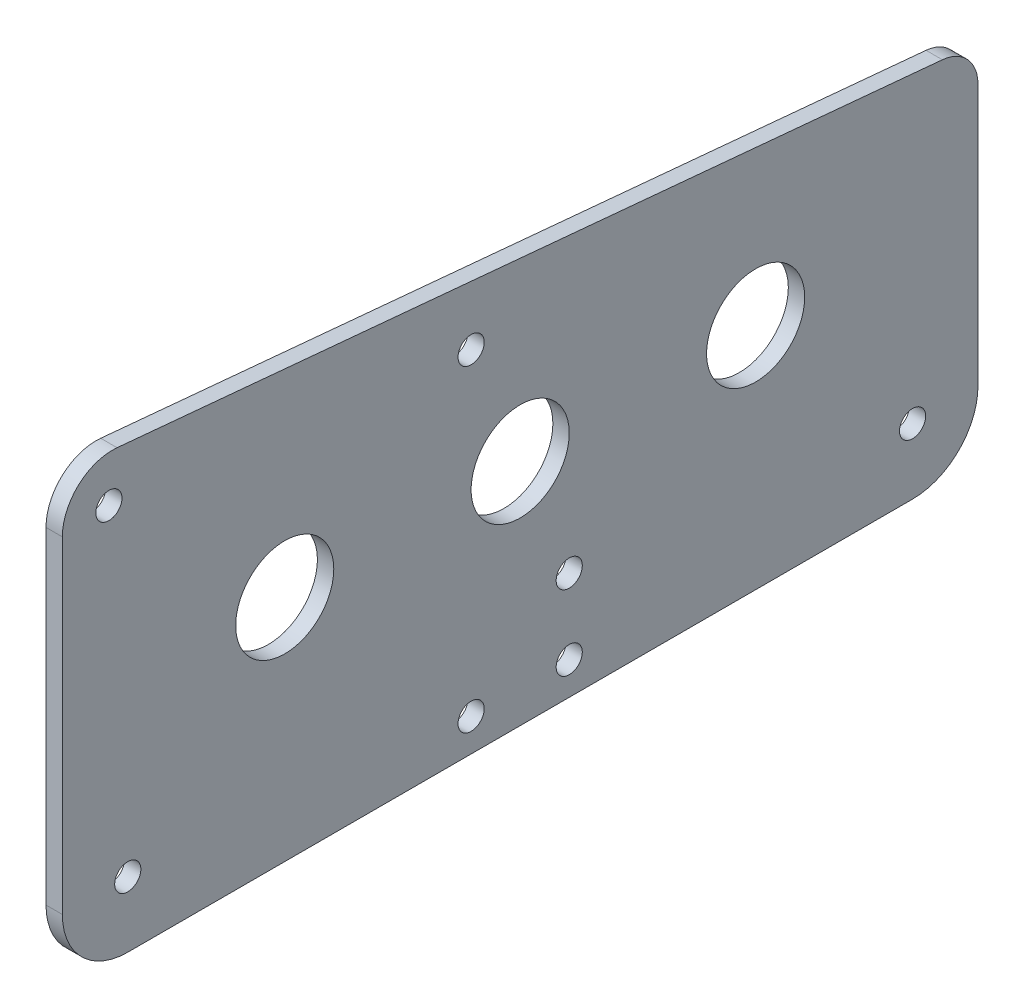
ISO-10303-21;
HEADER;
FILE_DESCRIPTION(('STEP AP214'),'2;1');
FILE_NAME('part.step','',(''),(''),'','','');
FILE_SCHEMA(('AUTOMOTIVE_DESIGN { 1 0 10303 214 1 1 1 1 }'));
ENDSEC;
DATA;
#1=APPLICATION_CONTEXT('core data for automotive mechanical design processes');
#2=APPLICATION_PROTOCOL_DEFINITION('international standard','automotive_design',2000,#1);
#3=PRODUCT_CONTEXT('',#1,'mechanical');
#4=PRODUCT('Part','Part','',(#3));
#5=PRODUCT_RELATED_PRODUCT_CATEGORY('part','',(#4));
#6=PRODUCT_DEFINITION_FORMATION('','',#4);
#7=PRODUCT_DEFINITION_CONTEXT('part definition',#1,'design');
#8=PRODUCT_DEFINITION('design','',#6,#7);
#9=PRODUCT_DEFINITION_SHAPE('','',#8);
#10=(LENGTH_UNIT() NAMED_UNIT(*) SI_UNIT(.MILLI.,.METRE.));
#11=(NAMED_UNIT(*) PLANE_ANGLE_UNIT() SI_UNIT($,.RADIAN.));
#12=(NAMED_UNIT(*) SI_UNIT($,.STERADIAN.) SOLID_ANGLE_UNIT());
#13=UNCERTAINTY_MEASURE_WITH_UNIT(LENGTH_MEASURE(1.E-05),#10,'distance_accuracy_value','');
#14=(GEOMETRIC_REPRESENTATION_CONTEXT(3) GLOBAL_UNCERTAINTY_ASSIGNED_CONTEXT((#13)) GLOBAL_UNIT_ASSIGNED_CONTEXT((#10,
#11,#12)) REPRESENTATION_CONTEXT('',''));
#15=CARTESIAN_POINT('',(0.,0.,0.));
#16=DIRECTION('',(0.,0.,1.));
#17=DIRECTION('',(1.,0.,0.));
#18=AXIS2_PLACEMENT_3D('',#15,#16,#17);
#19=CARTESIAN_POINT('',(4.7625,43.2742885665232,-519.572478048036));
#20=DIRECTION('',(1.,0.,0.));
#21=DIRECTION('',(0.,0.,-1.));
#22=AXIS2_PLACEMENT_3D('',#19,#20,#21);
#23=CYLINDRICAL_SURFACE('',#22,12.7);
#24=DIRECTION('',(1.,0.,0.));
#25=VECTOR('',#24,1.);
#26=CARTESIAN_POINT('',(4.7625,43.2742885665232,-506.872478048036));
#27=LINE('',#26,#25);
#28=CARTESIAN_POINT('',(1.5875,43.2742885665232,-506.872478048036));
#29=VERTEX_POINT('',#28);
#30=CARTESIAN_POINT('',(4.7625,43.2742885665232,-506.872478048036));
#31=VERTEX_POINT('',#30);
#32=EDGE_CURVE('E11',#29,#31,#27,.T.);
#33=ORIENTED_EDGE('',*,*,#32,.F.);
#34=CARTESIAN_POINT('',(1.5875,43.2742885665232,-519.572478048036));
#35=DIRECTION('',(1.,0.,0.));
#36=DIRECTION('',(0.,0.,-1.));
#37=AXIS2_PLACEMENT_3D('',#34,#35,#36);
#38=CIRCLE('',#37,12.7);
#39=CARTESIAN_POINT('',(1.5875,30.5742885665231,-519.572478048036));
#40=VERTEX_POINT('',#39);
#41=EDGE_CURVE('E107',#29,#40,#38,.T.);
#42=ORIENTED_EDGE('',*,*,#41,.T.);
#43=DIRECTION('',(1.,0.,0.));
#44=VECTOR('',#43,1.);
#45=CARTESIAN_POINT('',(4.7625,30.5742885665231,-519.572478048036));
#46=LINE('',#45,#44);
#47=CARTESIAN_POINT('',(4.7625,30.5742885665231,-519.572478048036));
#48=VERTEX_POINT('',#47);
#49=EDGE_CURVE('E48',#40,#48,#46,.T.);
#50=ORIENTED_EDGE('',*,*,#49,.T.);
#51=CARTESIAN_POINT('',(4.7625,43.2742885665232,-519.572478048036));
#52=DIRECTION('',(1.,0.,0.));
#53=DIRECTION('',(0.,0.,-1.));
#54=AXIS2_PLACEMENT_3D('',#51,#52,#53);
#55=CIRCLE('',#54,12.7);
#56=EDGE_CURVE('E164',#31,#48,#55,.T.);
#57=ORIENTED_EDGE('',*,*,#56,.F.);
#58=EDGE_LOOP('',(#33,#42,#50,#57));
#59=FACE_BOUND('',#58,.T.);
#60=ADVANCED_FACE('F38',(#59),#23,.T.);
#61=CARTESIAN_POINT('',(4.7625,30.5742885665232,-671.972478048036));
#62=DIRECTION('',(0.,-1.,0.));
#63=DIRECTION('',(0.,0.,-1.));
#64=AXIS2_PLACEMENT_3D('',#61,#62,#63);
#65=PLANE('',#64);
#66=ORIENTED_EDGE('',*,*,#49,.F.);
#67=DIRECTION('',(0.,0.,-1.));
#68=VECTOR('',#67,1.);
#69=CARTESIAN_POINT('',(1.5875,30.5742885665231,-516.597442574255));
#70=LINE('',#69,#68);
#71=CARTESIAN_POINT('',(1.5875,30.5742885665231,-671.972478048036));
#72=VERTEX_POINT('',#71);
#73=EDGE_CURVE('E129',#40,#72,#70,.T.);
#74=ORIENTED_EDGE('',*,*,#73,.T.);
#75=DIRECTION('',(1.,0.,0.));
#76=VECTOR('',#75,1.);
#77=CARTESIAN_POINT('',(4.7625,30.5742885665231,-671.972478048036));
#78=LINE('',#77,#76);
#79=CARTESIAN_POINT('',(4.7625,30.5742885665231,-671.972478048036));
#80=VERTEX_POINT('',#79);
#81=EDGE_CURVE('E157',#72,#80,#78,.T.);
#82=ORIENTED_EDGE('',*,*,#81,.T.);
#83=DIRECTION('',(0.,0.,-1.));
#84=VECTOR('',#83,1.);
#85=CARTESIAN_POINT('',(4.7625,30.5742885665232,-671.972478048036));
#86=LINE('',#85,#84);
#87=EDGE_CURVE('E174',#48,#80,#86,.T.);
#88=ORIENTED_EDGE('',*,*,#87,.F.);
#89=EDGE_LOOP('',(#66,#74,#82,#88));
#90=FACE_BOUND('',#89,.T.);
#91=ADVANCED_FACE('F177',(#90),#65,.T.);
#92=CARTESIAN_POINT('',(4.7625,43.2742885665232,-671.972478048036));
#93=DIRECTION('',(1.,0.,0.));
#94=DIRECTION('',(0.,0.,-1.));
#95=AXIS2_PLACEMENT_3D('',#92,#93,#94);
#96=CYLINDRICAL_SURFACE('',#95,12.7);
#97=ORIENTED_EDGE('',*,*,#81,.F.);
#98=CARTESIAN_POINT('',(1.5875,43.2742885665232,-671.972478048036));
#99=DIRECTION('',(1.,0.,0.));
#100=DIRECTION('',(0.,0.,-1.));
#101=AXIS2_PLACEMENT_3D('',#98,#99,#100);
#102=CIRCLE('',#101,12.7);
#103=CARTESIAN_POINT('',(1.5875,43.2742885665232,-684.672478048036));
#104=VERTEX_POINT('',#103);
#105=EDGE_CURVE('E126',#72,#104,#102,.T.);
#106=ORIENTED_EDGE('',*,*,#105,.T.);
#107=DIRECTION('',(1.,0.,0.));
#108=VECTOR('',#107,1.);
#109=CARTESIAN_POINT('',(4.7625,43.2742885665232,-684.672478048036));
#110=LINE('',#109,#108);
#111=CARTESIAN_POINT('',(4.7625,43.2742885665232,-684.672478048036));
#112=VERTEX_POINT('',#111);
#113=EDGE_CURVE('E154',#104,#112,#110,.T.);
#114=ORIENTED_EDGE('',*,*,#113,.T.);
#115=CARTESIAN_POINT('',(4.7625,43.2742885665232,-671.972478048036));
#116=DIRECTION('',(1.,0.,0.));
#117=DIRECTION('',(0.,0.,-1.));
#118=AXIS2_PLACEMENT_3D('',#115,#116,#117);
#119=CIRCLE('',#118,12.7);
#120=EDGE_CURVE('E178',#80,#112,#119,.T.);
#121=ORIENTED_EDGE('',*,*,#120,.F.);
#122=EDGE_LOOP('',(#97,#106,#114,#121));
#123=FACE_BOUND('',#122,.T.);
#124=ADVANCED_FACE('F240',(#123),#96,.T.);
#125=CARTESIAN_POINT('',(4.7625,93.978860816529,-684.672478048036));
#126=DIRECTION('',(0.,0.,-1.));
#127=DIRECTION('',(0.,1.,0.));
#128=AXIS2_PLACEMENT_3D('',#125,#126,#127);
#129=PLANE('',#128);
#130=ORIENTED_EDGE('',*,*,#113,.F.);
#131=DIRECTION('',(0.,1.,0.));
#132=VECTOR('',#131,1.);
#133=CARTESIAN_POINT('',(1.5875,106.774288566523,-684.672478048036));
#134=LINE('',#133,#132);
#135=CARTESIAN_POINT('',(1.5875,93.978860816529,-684.672478048036));
#136=VERTEX_POINT('',#135);
#137=EDGE_CURVE('E123',#104,#136,#134,.T.);
#138=ORIENTED_EDGE('',*,*,#137,.T.);
#139=DIRECTION('',(1.,0.,0.));
#140=VECTOR('',#139,1.);
#141=CARTESIAN_POINT('',(4.7625,93.978860816529,-684.672478048036));
#142=LINE('',#141,#140);
#143=CARTESIAN_POINT('',(4.7625,93.978860816529,-684.672478048036));
#144=VERTEX_POINT('',#143);
#145=EDGE_CURVE('E151',#136,#144,#142,.T.);
#146=ORIENTED_EDGE('',*,*,#145,.T.);
#147=DIRECTION('',(0.,1.,0.));
#148=VECTOR('',#147,1.);
#149=CARTESIAN_POINT('',(4.7625,93.978860816529,-684.672478048036));
#150=LINE('',#149,#148);
#151=EDGE_CURVE('E180',#112,#144,#150,.T.);
#152=ORIENTED_EDGE('',*,*,#151,.F.);
#153=EDGE_LOOP('',(#130,#138,#146,#152));
#154=FACE_BOUND('',#153,.T.);
#155=ADVANCED_FACE('F318',(#154),#129,.T.);
#156=CARTESIAN_POINT('',(4.7625,93.978860816529,-677.052478048036));
#157=DIRECTION('',(1.,0.,0.));
#158=DIRECTION('',(0.,0.,-1.));
#159=AXIS2_PLACEMENT_3D('',#156,#157,#158);
#160=CYLINDRICAL_SURFACE('',#159,7.61999999999997);
#161=ORIENTED_EDGE('',*,*,#145,.F.);
#162=CARTESIAN_POINT('',(1.5875,93.978860816529,-677.052478048036));
#163=DIRECTION('',(1.,0.,0.));
#164=DIRECTION('',(0.,0.,-1.));
#165=AXIS2_PLACEMENT_3D('',#162,#163,#164);
#166=CIRCLE('',#165,7.61999999999997);
#167=CARTESIAN_POINT('',(1.5875,101.566176390487,-677.757490375002));
#168=VERTEX_POINT('',#167);
#169=EDGE_CURVE('E120',#136,#168,#166,.T.);
#170=ORIENTED_EDGE('',*,*,#169,.T.);
#171=DIRECTION('',(1.,0.,0.));
#172=VECTOR('',#171,1.);
#173=CARTESIAN_POINT('',(4.7625,101.566176390487,-677.757490375002));
#174=LINE('',#173,#172);
#175=CARTESIAN_POINT('',(4.7625,101.566176390487,-677.757490375002));
#176=VERTEX_POINT('',#175);
#177=EDGE_CURVE('E149',#168,#176,#174,.T.);
#178=ORIENTED_EDGE('',*,*,#177,.T.);
#179=CARTESIAN_POINT('',(4.7625,93.978860816529,-677.052478048036));
#180=DIRECTION('',(1.,0.,0.));
#181=DIRECTION('',(0.,0.,-1.));
#182=AXIS2_PLACEMENT_3D('',#179,#180,#181);
#183=CIRCLE('',#182,7.61999999999997);
#184=EDGE_CURVE('E186',#144,#176,#183,.T.);
#185=ORIENTED_EDGE('',*,*,#184,.F.);
#186=EDGE_LOOP('',(#161,#170,#178,#185));
#187=FACE_BOUND('',#186,.T.);
#188=ADVANCED_FACE('F323',(#187),#160,.T.);
#189=CARTESIAN_POINT('',(4.7625,116.457539853395,-517.497208961432));
#190=DIRECTION('',(0.,0.995710705243837,-0.0925213027514316));
#191=DIRECTION('',(0.,0.0925213027514316,0.995710705243836));
#192=AXIS2_PLACEMENT_3D('',#189,#190,#191);
#193=PLANE('',#192);
#194=ORIENTED_EDGE('',*,*,#177,.F.);
#195=DIRECTION('',(0.,0.0925213027514316,0.995710705243836));
#196=VECTOR('',#195,1.);
#197=CARTESIAN_POINT('',(1.5875,116.457539853395,-517.497208961432));
#198=LINE('',#197,#196);
#199=CARTESIAN_POINT('',(1.5875,116.457539853395,-517.497208961432));
#200=VERTEX_POINT('',#199);
#201=EDGE_CURVE('E117',#168,#200,#198,.T.);
#202=ORIENTED_EDGE('',*,*,#201,.T.);
#203=DIRECTION('',(1.,0.,0.));
#204=VECTOR('',#203,1.);
#205=CARTESIAN_POINT('',(4.7625,116.457539853395,-517.497208961432));
#206=LINE('',#205,#204);
#207=CARTESIAN_POINT('',(4.7625,116.457539853395,-517.497208961432));
#208=VERTEX_POINT('',#207);
#209=EDGE_CURVE('E56',#200,#208,#206,.T.);
#210=ORIENTED_EDGE('',*,*,#209,.T.);
#211=DIRECTION('',(0.,0.0925213027514316,0.995710705243836));
#212=VECTOR('',#211,1.);
#213=CARTESIAN_POINT('',(4.7625,116.457539853395,-517.497208961432));
#214=LINE('',#213,#212);
#215=EDGE_CURVE('E189',#176,#208,#214,.T.);
#216=ORIENTED_EDGE('',*,*,#215,.F.);
#217=EDGE_LOOP('',(#194,#202,#210,#216));
#218=FACE_BOUND('',#217,.T.);
#219=ADVANCED_FACE('F324',(#218),#193,.T.);
#220=CARTESIAN_POINT('',(4.7625,106.774288566523,-516.597442574255));
#221=DIRECTION('',(1.,0.,0.));
#222=DIRECTION('',(0.,0.,-1.));
#223=AXIS2_PLACEMENT_3D('',#220,#221,#222);
#224=CYLINDRICAL_SURFACE('',#223,9.72496452621818);
#225=ORIENTED_EDGE('',*,*,#209,.F.);
#226=CARTESIAN_POINT('',(1.5875,106.774288566523,-516.597442574255));
#227=DIRECTION('',(1.,0.,0.));
#228=DIRECTION('',(0.,0.,-1.));
#229=AXIS2_PLACEMENT_3D('',#226,#227,#228);
#230=CIRCLE('',#229,9.72496452621818);
#231=CARTESIAN_POINT('',(1.5875,106.774288566523,-506.872478048036));
#232=VERTEX_POINT('',#231);
#233=EDGE_CURVE('E105',#200,#232,#230,.T.);
#234=ORIENTED_EDGE('',*,*,#233,.T.);
#235=DIRECTION('',(1.,0.,0.));
#236=VECTOR('',#235,1.);
#237=CARTESIAN_POINT('',(4.7625,106.774288566523,-506.872478048036));
#238=LINE('',#237,#236);
#239=CARTESIAN_POINT('',(4.7625,106.774288566523,-506.872478048036));
#240=VERTEX_POINT('',#239);
#241=EDGE_CURVE('E42',#232,#240,#238,.T.);
#242=ORIENTED_EDGE('',*,*,#241,.T.);
#243=CARTESIAN_POINT('',(4.7625,106.774288566523,-516.597442574255));
#244=DIRECTION('',(1.,0.,0.));
#245=DIRECTION('',(0.,0.,-1.));
#246=AXIS2_PLACEMENT_3D('',#243,#244,#245);
#247=CIRCLE('',#246,9.72496452621818);
#248=EDGE_CURVE('E310',#208,#240,#247,.T.);
#249=ORIENTED_EDGE('',*,*,#248,.F.);
#250=EDGE_LOOP('',(#225,#234,#242,#249));
#251=FACE_BOUND('',#250,.T.);
#252=ADVANCED_FACE('F109',(#251),#224,.T.);
#253=CARTESIAN_POINT('',(4.7625,43.2742885665232,-519.572478048036));
#254=DIRECTION('',(1.,0.,0.));
#255=DIRECTION('',(0.,0.,-1.));
#256=AXIS2_PLACEMENT_3D('',#253,#254,#255);
#257=CYLINDRICAL_SURFACE('',#256,2.53999999999995);
#258=CARTESIAN_POINT('',(4.7625,43.2742885665232,-519.572478048036));
#259=DIRECTION('',(1.,0.,0.));
#260=DIRECTION('',(0.,0.,-1.));
#261=AXIS2_PLACEMENT_3D('',#258,#259,#260);
#262=CIRCLE('',#261,2.53999999999995);
#263=CARTESIAN_POINT('',(4.7625,43.2742885665232,-522.112478048036));
#264=VERTEX_POINT('',#263);
#265=EDGE_CURVE('E147',#264,#264,#262,.T.);
#266=ORIENTED_EDGE('',*,*,#265,.T.);
#267=EDGE_LOOP('',(#266));
#268=FACE_BOUND('',#267,.T.);
#269=CARTESIAN_POINT('',(1.5875,43.2742885665232,-519.572478048036));
#270=DIRECTION('',(1.,0.,0.));
#271=DIRECTION('',(0.,0.,-1.));
#272=AXIS2_PLACEMENT_3D('',#269,#270,#271);
#273=CIRCLE('',#272,2.53999999999995);
#274=CARTESIAN_POINT('',(1.5875,43.2742885665232,-522.112478048036));
#275=VERTEX_POINT('',#274);
#276=EDGE_CURVE('E206',#275,#275,#273,.T.);
#277=ORIENTED_EDGE('',*,*,#276,.F.);
#278=EDGE_LOOP('',(#277));
#279=FACE_BOUND('',#278,.T.);
#280=ADVANCED_FACE('F281',(#268,#279),#257,.F.);
#281=CARTESIAN_POINT('',(4.7625,36.9242885665232,-605.297478048036));
#282=DIRECTION('',(1.,0.,0.));
#283=DIRECTION('',(0.,0.,-1.));
#284=AXIS2_PLACEMENT_3D('',#281,#282,#283);
#285=CYLINDRICAL_SURFACE('',#284,2.53999999999995);
#286=CARTESIAN_POINT('',(4.7625,36.9242885665232,-605.297478048036));
#287=DIRECTION('',(1.,0.,0.));
#288=DIRECTION('',(0.,0.,-1.));
#289=AXIS2_PLACEMENT_3D('',#286,#287,#288);
#290=CIRCLE('',#289,2.53999999999995);
#291=CARTESIAN_POINT('',(4.7625,36.9242885665232,-607.837478048036));
#292=VERTEX_POINT('',#291);
#293=EDGE_CURVE('E292',#292,#292,#290,.T.);
#294=ORIENTED_EDGE('',*,*,#293,.T.);
#295=EDGE_LOOP('',(#294));
#296=FACE_BOUND('',#295,.T.);
#297=CARTESIAN_POINT('',(1.5875,36.9242885665232,-605.297478048036));
#298=DIRECTION('',(1.,0.,0.));
#299=DIRECTION('',(0.,0.,-1.));
#300=AXIS2_PLACEMENT_3D('',#297,#298,#299);
#301=CIRCLE('',#300,2.53999999999995);
#302=CARTESIAN_POINT('',(1.5875,36.9242885665232,-607.837478048036));
#303=VERTEX_POINT('',#302);
#304=EDGE_CURVE('E209',#303,#303,#301,.T.);
#305=ORIENTED_EDGE('',*,*,#304,.F.);
#306=EDGE_LOOP('',(#305));
#307=FACE_BOUND('',#306,.T.);
#308=ADVANCED_FACE('F231',(#296,#307),#285,.F.);
#309=CARTESIAN_POINT('',(4.7625,98.5707187630519,-586.247478048036));
#310=DIRECTION('',(1.,0.,0.));
#311=DIRECTION('',(0.,0.,-1.));
#312=AXIS2_PLACEMENT_3D('',#309,#310,#311);
#313=CYLINDRICAL_SURFACE('',#312,2.53999999999995);
#314=CARTESIAN_POINT('',(4.7625,98.5707187630519,-586.247478048036));
#315=DIRECTION('',(1.,0.,0.));
#316=DIRECTION('',(0.,0.,-1.));
#317=AXIS2_PLACEMENT_3D('',#314,#315,#316);
#318=CIRCLE('',#317,2.53999999999995);
#319=CARTESIAN_POINT('',(4.7625,98.5707187630519,-588.787478048036));
#320=VERTEX_POINT('',#319);
#321=EDGE_CURVE('E298',#320,#320,#318,.T.);
#322=ORIENTED_EDGE('',*,*,#321,.T.);
#323=EDGE_LOOP('',(#322));
#324=FACE_BOUND('',#323,.T.);
#325=CARTESIAN_POINT('',(1.5875,98.5707187630519,-586.247478048036));
#326=DIRECTION('',(1.,0.,0.));
#327=DIRECTION('',(0.,0.,-1.));
#328=AXIS2_PLACEMENT_3D('',#325,#326,#327);
#329=CIRCLE('',#328,2.53999999999995);
#330=CARTESIAN_POINT('',(1.5875,98.5707187630519,-588.787478048036));
#331=VERTEX_POINT('',#330);
#332=EDGE_CURVE('E212',#331,#331,#329,.T.);
#333=ORIENTED_EDGE('',*,*,#332,.F.);
#334=EDGE_LOOP('',(#333));
#335=FACE_BOUND('',#334,.T.);
#336=ADVANCED_FACE('F222',(#324,#335),#313,.F.);
#337=CARTESIAN_POINT('',(4.7625,75.0242885665232,-595.772478048036));
#338=DIRECTION('',(1.,0.,0.));
#339=DIRECTION('',(0.,0.,-1.));
#340=AXIS2_PLACEMENT_3D('',#337,#338,#339);
#341=CYLINDRICAL_SURFACE('',#340,9.52500000000002);
#342=CARTESIAN_POINT('',(4.7625,75.0242885665232,-595.772478048036));
#343=DIRECTION('',(1.,0.,0.));
#344=DIRECTION('',(0.,0.,-1.));
#345=AXIS2_PLACEMENT_3D('',#342,#343,#344);
#346=CIRCLE('',#345,9.52500000000002);
#347=CARTESIAN_POINT('',(4.7625,75.0242885665232,-605.297478048036));
#348=VERTEX_POINT('',#347);
#349=EDGE_CURVE('E301',#348,#348,#346,.T.);
#350=ORIENTED_EDGE('',*,*,#349,.T.);
#351=EDGE_LOOP('',(#350));
#352=FACE_BOUND('',#351,.T.);
#353=CARTESIAN_POINT('',(1.5875,75.0242885665232,-595.772478048036));
#354=DIRECTION('',(1.,0.,0.));
#355=DIRECTION('',(0.,0.,-1.));
#356=AXIS2_PLACEMENT_3D('',#353,#354,#355);
#357=CIRCLE('',#356,9.52500000000002);
#358=CARTESIAN_POINT('',(1.5875,75.0242885665232,-605.297478048036));
#359=VERTEX_POINT('',#358);
#360=EDGE_CURVE('E113',#359,#359,#357,.T.);
#361=ORIENTED_EDGE('',*,*,#360,.F.);
#362=EDGE_LOOP('',(#361));
#363=FACE_BOUND('',#362,.T.);
#364=ADVANCED_FACE('F219',(#352,#363),#341,.F.);
#365=CARTESIAN_POINT('',(4.7625,107.527203864905,-515.91124467509));
#366=DIRECTION('',(1.,0.,0.));
#367=DIRECTION('',(0.,0.,-1.));
#368=AXIS2_PLACEMENT_3D('',#365,#366,#367);
#369=CYLINDRICAL_SURFACE('',#368,2.53999999999995);
#370=CARTESIAN_POINT('',(4.7625,107.527203864905,-515.91124467509));
#371=DIRECTION('',(1.,0.,0.));
#372=DIRECTION('',(0.,0.,-1.));
#373=AXIS2_PLACEMENT_3D('',#370,#371,#372);
#374=CIRCLE('',#373,2.53999999999995);
#375=CARTESIAN_POINT('',(4.7625,107.527203864905,-518.45124467509));
#376=VERTEX_POINT('',#375);
#377=EDGE_CURVE('E307',#376,#376,#374,.T.);
#378=ORIENTED_EDGE('',*,*,#377,.T.);
#379=EDGE_LOOP('',(#378));
#380=FACE_BOUND('',#379,.T.);
#381=CARTESIAN_POINT('',(1.5875,107.527203864905,-515.91124467509));
#382=DIRECTION('',(1.,0.,0.));
#383=DIRECTION('',(0.,0.,-1.));
#384=AXIS2_PLACEMENT_3D('',#381,#382,#383);
#385=CIRCLE('',#384,2.53999999999995);
#386=CARTESIAN_POINT('',(1.5875,107.527203864905,-518.45124467509));
#387=VERTEX_POINT('',#386);
#388=EDGE_CURVE('E110',#387,#387,#385,.T.);
#389=ORIENTED_EDGE('',*,*,#388,.F.);
#390=EDGE_LOOP('',(#389));
#391=FACE_BOUND('',#390,.T.);
#392=ADVANCED_FACE('F221',(#380,#391),#369,.F.);
#393=CARTESIAN_POINT('',(4.7625,43.2742885665232,-506.872478048036));
#394=DIRECTION('',(0.,0.,1.));
#395=DIRECTION('',(0.,-1.,0.));
#396=AXIS2_PLACEMENT_3D('',#393,#394,#395);
#397=PLANE('',#396);
#398=DIRECTION('',(0.,1.,0.));
#399=VECTOR('',#398,1.);
#400=CARTESIAN_POINT('',(1.5875,106.774288566523,-506.872478048036));
#401=LINE('',#400,#399);
#402=EDGE_CURVE('E93',#232,#29,#401,.F.);
#403=ORIENTED_EDGE('',*,*,#402,.T.);
#404=ORIENTED_EDGE('',*,*,#32,.T.);
#405=DIRECTION('',(0.,-1.,0.));
#406=VECTOR('',#405,1.);
#407=CARTESIAN_POINT('',(4.7625,43.2742885665232,-506.872478048036));
#408=LINE('',#407,#406);
#409=EDGE_CURVE('E95',#240,#31,#408,.T.);
#410=ORIENTED_EDGE('',*,*,#409,.F.);
#411=ORIENTED_EDGE('',*,*,#241,.F.);
#412=EDGE_LOOP('',(#403,#404,#410,#411));
#413=FACE_BOUND('',#412,.T.);
#414=ADVANCED_FACE('F92',(#413),#397,.T.);
#415=CARTESIAN_POINT('',(4.7625,75.0242885665232,-550.052478048036));
#416=DIRECTION('',(1.,0.,0.));
#417=DIRECTION('',(0.,0.,-1.));
#418=AXIS2_PLACEMENT_3D('',#415,#416,#417);
#419=CYLINDRICAL_SURFACE('',#418,9.52500000000002);
#420=CARTESIAN_POINT('',(4.7625,75.0242885665232,-550.052478048036));
#421=DIRECTION('',(1.,0.,0.));
#422=DIRECTION('',(0.,0.,-1.));
#423=AXIS2_PLACEMENT_3D('',#420,#421,#422);
#424=CIRCLE('',#423,9.52500000000002);
#425=CARTESIAN_POINT('',(4.7625,75.0242885665232,-559.577478048036));
#426=VERTEX_POINT('',#425);
#427=EDGE_CURVE('E192',#426,#426,#424,.T.);
#428=ORIENTED_EDGE('',*,*,#427,.T.);
#429=EDGE_LOOP('',(#428));
#430=FACE_BOUND('',#429,.T.);
#431=CARTESIAN_POINT('',(1.5875,75.0242885665232,-550.052478048036));
#432=DIRECTION('',(1.,0.,0.));
#433=DIRECTION('',(0.,0.,-1.));
#434=AXIS2_PLACEMENT_3D('',#431,#432,#433);
#435=CIRCLE('',#434,9.52500000000002);
#436=CARTESIAN_POINT('',(1.5875,75.0242885665232,-559.577478048036));
#437=VERTEX_POINT('',#436);
#438=EDGE_CURVE('E119',#437,#437,#435,.T.);
#439=ORIENTED_EDGE('',*,*,#438,.F.);
#440=EDGE_LOOP('',(#439));
#441=FACE_BOUND('',#440,.T.);
#442=ADVANCED_FACE('F246',(#430,#441),#419,.F.);
#443=CARTESIAN_POINT('',(4.7625,51.4778583699945,-605.297478048036));
#444=DIRECTION('',(1.,0.,0.));
#445=DIRECTION('',(0.,0.,-1.));
#446=AXIS2_PLACEMENT_3D('',#443,#444,#445);
#447=CYLINDRICAL_SURFACE('',#446,2.54000000000007);
#448=CARTESIAN_POINT('',(4.7625,51.4778583699945,-605.297478048036));
#449=DIRECTION('',(1.,0.,0.));
#450=DIRECTION('',(0.,0.,-1.));
#451=AXIS2_PLACEMENT_3D('',#448,#449,#450);
#452=CIRCLE('',#451,2.54000000000007);
#453=CARTESIAN_POINT('',(4.7625,51.4778583699945,-607.837478048036));
#454=VERTEX_POINT('',#453);
#455=EDGE_CURVE('E195',#454,#454,#452,.T.);
#456=ORIENTED_EDGE('',*,*,#455,.T.);
#457=EDGE_LOOP('',(#456));
#458=FACE_BOUND('',#457,.T.);
#459=CARTESIAN_POINT('',(1.5875,51.4778583699945,-605.297478048036));
#460=DIRECTION('',(1.,0.,0.));
#461=DIRECTION('',(0.,0.,-1.));
#462=AXIS2_PLACEMENT_3D('',#459,#460,#461);
#463=CIRCLE('',#462,2.54000000000007);
#464=CARTESIAN_POINT('',(1.5875,51.4778583699945,-607.837478048036));
#465=VERTEX_POINT('',#464);
#466=EDGE_CURVE('E135',#465,#465,#463,.T.);
#467=ORIENTED_EDGE('',*,*,#466,.F.);
#468=EDGE_LOOP('',(#467));
#469=FACE_BOUND('',#468,.T.);
#470=ADVANCED_FACE('F249',(#458,#469),#447,.F.);
#471=CARTESIAN_POINT('',(4.7625,75.0242885665232,-641.492478048036));
#472=DIRECTION('',(1.,0.,0.));
#473=DIRECTION('',(0.,0.,-1.));
#474=AXIS2_PLACEMENT_3D('',#471,#472,#473);
#475=CYLINDRICAL_SURFACE('',#474,9.52500000000002);
#476=CARTESIAN_POINT('',(4.7625,75.0242885665232,-641.492478048036));
#477=DIRECTION('',(1.,0.,0.));
#478=DIRECTION('',(0.,0.,-1.));
#479=AXIS2_PLACEMENT_3D('',#476,#477,#478);
#480=CIRCLE('',#479,9.52500000000002);
#481=CARTESIAN_POINT('',(4.7625,75.0242885665232,-651.017478048036));
#482=VERTEX_POINT('',#481);
#483=EDGE_CURVE('E198',#482,#482,#480,.T.);
#484=ORIENTED_EDGE('',*,*,#483,.T.);
#485=EDGE_LOOP('',(#484));
#486=FACE_BOUND('',#485,.T.);
#487=CARTESIAN_POINT('',(1.5875,75.0242885665232,-641.492478048036));
#488=DIRECTION('',(1.,0.,0.));
#489=DIRECTION('',(0.,0.,-1.));
#490=AXIS2_PLACEMENT_3D('',#487,#488,#489);
#491=CIRCLE('',#490,9.52500000000002);
#492=CARTESIAN_POINT('',(1.5875,75.0242885665232,-651.017478048036));
#493=VERTEX_POINT('',#492);
#494=EDGE_CURVE('E138',#493,#493,#491,.T.);
#495=ORIENTED_EDGE('',*,*,#494,.F.);
#496=EDGE_LOOP('',(#495));
#497=FACE_BOUND('',#496,.T.);
#498=ADVANCED_FACE('F253',(#486,#497),#475,.F.);
#499=CARTESIAN_POINT('',(4.7625,36.9242885665232,-586.247478048036));
#500=DIRECTION('',(1.,0.,0.));
#501=DIRECTION('',(0.,0.,-1.));
#502=AXIS2_PLACEMENT_3D('',#499,#500,#501);
#503=CYLINDRICAL_SURFACE('',#502,2.53999999999995);
#504=CARTESIAN_POINT('',(4.7625,36.9242885665232,-586.247478048036));
#505=DIRECTION('',(1.,0.,0.));
#506=DIRECTION('',(0.,0.,-1.));
#507=AXIS2_PLACEMENT_3D('',#504,#505,#506);
#508=CIRCLE('',#507,2.53999999999995);
#509=CARTESIAN_POINT('',(4.7625,36.9242885665232,-588.787478048036));
#510=VERTEX_POINT('',#509);
#511=EDGE_CURVE('E201',#510,#510,#508,.T.);
#512=ORIENTED_EDGE('',*,*,#511,.T.);
#513=EDGE_LOOP('',(#512));
#514=FACE_BOUND('',#513,.T.);
#515=CARTESIAN_POINT('',(1.5875,36.9242885665232,-586.247478048036));
#516=DIRECTION('',(1.,0.,0.));
#517=DIRECTION('',(0.,0.,-1.));
#518=AXIS2_PLACEMENT_3D('',#515,#516,#517);
#519=CIRCLE('',#518,2.53999999999995);
#520=CARTESIAN_POINT('',(1.5875,36.9242885665232,-588.787478048036));
#521=VERTEX_POINT('',#520);
#522=EDGE_CURVE('E141',#521,#521,#519,.T.);
#523=ORIENTED_EDGE('',*,*,#522,.F.);
#524=EDGE_LOOP('',(#523));
#525=FACE_BOUND('',#524,.T.);
#526=ADVANCED_FACE('F256',(#514,#525),#503,.F.);
#527=CARTESIAN_POINT('',(4.7625,43.2742885665232,-671.972478048036));
#528=DIRECTION('',(1.,0.,0.));
#529=DIRECTION('',(0.,0.,-1.));
#530=AXIS2_PLACEMENT_3D('',#527,#528,#529);
#531=CYLINDRICAL_SURFACE('',#530,2.53999999999995);
#532=CARTESIAN_POINT('',(4.7625,43.2742885665232,-671.972478048036));
#533=DIRECTION('',(1.,0.,0.));
#534=DIRECTION('',(0.,0.,-1.));
#535=AXIS2_PLACEMENT_3D('',#532,#533,#534);
#536=CIRCLE('',#535,2.53999999999995);
#537=CARTESIAN_POINT('',(4.7625,43.2742885665232,-674.512478048036));
#538=VERTEX_POINT('',#537);
#539=EDGE_CURVE('E99',#538,#538,#536,.T.);
#540=ORIENTED_EDGE('',*,*,#539,.T.);
#541=EDGE_LOOP('',(#540));
#542=FACE_BOUND('',#541,.T.);
#543=CARTESIAN_POINT('',(1.5875,43.2742885665232,-671.972478048036));
#544=DIRECTION('',(1.,0.,0.));
#545=DIRECTION('',(0.,0.,-1.));
#546=AXIS2_PLACEMENT_3D('',#543,#544,#545);
#547=CIRCLE('',#546,2.53999999999995);
#548=CARTESIAN_POINT('',(1.5875,43.2742885665232,-674.512478048036));
#549=VERTEX_POINT('',#548);
#550=EDGE_CURVE('E144',#549,#549,#547,.T.);
#551=ORIENTED_EDGE('',*,*,#550,.F.);
#552=EDGE_LOOP('',(#551));
#553=FACE_BOUND('',#552,.T.);
#554=ADVANCED_FACE('F40',(#542,#553),#531,.F.);
#555=CARTESIAN_POINT('',(4.7625,106.774288566523,-516.597442574255));
#556=DIRECTION('',(1.,0.,0.));
#557=DIRECTION('',(0.,0.,-1.));
#558=AXIS2_PLACEMENT_3D('',#555,#556,#557);
#559=PLANE('',#558);
#560=ORIENTED_EDGE('',*,*,#265,.F.);
#561=EDGE_LOOP('',(#560));
#562=FACE_BOUND('',#561,.T.);
#563=ORIENTED_EDGE('',*,*,#293,.F.);
#564=EDGE_LOOP('',(#563));
#565=FACE_BOUND('',#564,.T.);
#566=ORIENTED_EDGE('',*,*,#321,.F.);
#567=EDGE_LOOP('',(#566));
#568=FACE_BOUND('',#567,.T.);
#569=ORIENTED_EDGE('',*,*,#349,.F.);
#570=EDGE_LOOP('',(#569));
#571=FACE_BOUND('',#570,.T.);
#572=ORIENTED_EDGE('',*,*,#377,.F.);
#573=EDGE_LOOP('',(#572));
#574=FACE_BOUND('',#573,.T.);
#575=ORIENTED_EDGE('',*,*,#248,.T.);
#576=ORIENTED_EDGE('',*,*,#409,.T.);
#577=ORIENTED_EDGE('',*,*,#56,.T.);
#578=ORIENTED_EDGE('',*,*,#87,.T.);
#579=ORIENTED_EDGE('',*,*,#120,.T.);
#580=ORIENTED_EDGE('',*,*,#151,.T.);
#581=ORIENTED_EDGE('',*,*,#184,.T.);
#582=ORIENTED_EDGE('',*,*,#215,.T.);
#583=EDGE_LOOP('',(#575,#576,#577,#578,#579,#580,#581,#582));
#584=FACE_BOUND('',#583,.T.);
#585=ORIENTED_EDGE('',*,*,#427,.F.);
#586=EDGE_LOOP('',(#585));
#587=FACE_BOUND('',#586,.T.);
#588=ORIENTED_EDGE('',*,*,#455,.F.);
#589=EDGE_LOOP('',(#588));
#590=FACE_BOUND('',#589,.T.);
#591=ORIENTED_EDGE('',*,*,#483,.F.);
#592=EDGE_LOOP('',(#591));
#593=FACE_BOUND('',#592,.T.);
#594=ORIENTED_EDGE('',*,*,#511,.F.);
#595=EDGE_LOOP('',(#594));
#596=FACE_BOUND('',#595,.T.);
#597=ORIENTED_EDGE('',*,*,#539,.F.);
#598=EDGE_LOOP('',(#597));
#599=FACE_BOUND('',#598,.T.);
#600=ADVANCED_FACE('F171',(#562,#565,#568,#571,#574,#584,#587,#590,#593,#596,#599),#559,.T.);
#601=CARTESIAN_POINT('',(1.5875,106.774288566523,-516.597442574255));
#602=DIRECTION('',(1.,0.,0.));
#603=DIRECTION('',(0.,0.,-1.));
#604=AXIS2_PLACEMENT_3D('',#601,#602,#603);
#605=PLANE('',#604);
#606=ORIENTED_EDGE('',*,*,#276,.T.);
#607=EDGE_LOOP('',(#606));
#608=FACE_BOUND('',#607,.T.);
#609=ORIENTED_EDGE('',*,*,#304,.T.);
#610=EDGE_LOOP('',(#609));
#611=FACE_BOUND('',#610,.T.);
#612=ORIENTED_EDGE('',*,*,#332,.T.);
#613=EDGE_LOOP('',(#612));
#614=FACE_BOUND('',#613,.T.);
#615=ORIENTED_EDGE('',*,*,#360,.T.);
#616=EDGE_LOOP('',(#615));
#617=FACE_BOUND('',#616,.T.);
#618=ORIENTED_EDGE('',*,*,#388,.T.);
#619=EDGE_LOOP('',(#618));
#620=FACE_BOUND('',#619,.T.);
#621=ORIENTED_EDGE('',*,*,#233,.F.);
#622=ORIENTED_EDGE('',*,*,#201,.F.);
#623=ORIENTED_EDGE('',*,*,#169,.F.);
#624=ORIENTED_EDGE('',*,*,#137,.F.);
#625=ORIENTED_EDGE('',*,*,#105,.F.);
#626=ORIENTED_EDGE('',*,*,#73,.F.);
#627=ORIENTED_EDGE('',*,*,#41,.F.);
#628=ORIENTED_EDGE('',*,*,#402,.F.);
#629=EDGE_LOOP('',(#621,#622,#623,#624,#625,#626,#627,#628));
#630=FACE_BOUND('',#629,.T.);
#631=ORIENTED_EDGE('',*,*,#438,.T.);
#632=EDGE_LOOP('',(#631));
#633=FACE_BOUND('',#632,.T.);
#634=ORIENTED_EDGE('',*,*,#466,.T.);
#635=EDGE_LOOP('',(#634));
#636=FACE_BOUND('',#635,.T.);
#637=ORIENTED_EDGE('',*,*,#494,.T.);
#638=EDGE_LOOP('',(#637));
#639=FACE_BOUND('',#638,.T.);
#640=ORIENTED_EDGE('',*,*,#522,.T.);
#641=EDGE_LOOP('',(#640));
#642=FACE_BOUND('',#641,.T.);
#643=ORIENTED_EDGE('',*,*,#550,.T.);
#644=EDGE_LOOP('',(#643));
#645=FACE_BOUND('',#644,.T.);
#646=ADVANCED_FACE('F102',(#608,#611,#614,#617,#620,#630,#633,#636,#639,#642,#645),#605,.F.);
#647=CLOSED_SHELL('',(#60,#91,#124,#155,#188,#219,#252,#280,#308,#336,#364,#392,#414,#442,#470,
#498,#526,#554,#600,#646));
#648=MANIFOLD_SOLID_BREP('B2',#647);
#649=ADVANCED_BREP_SHAPE_REPRESENTATION('',(#18,#648),#14);
#650=SHAPE_DEFINITION_REPRESENTATION(#9,#649);
ENDSEC;
END-ISO-10303-21;
